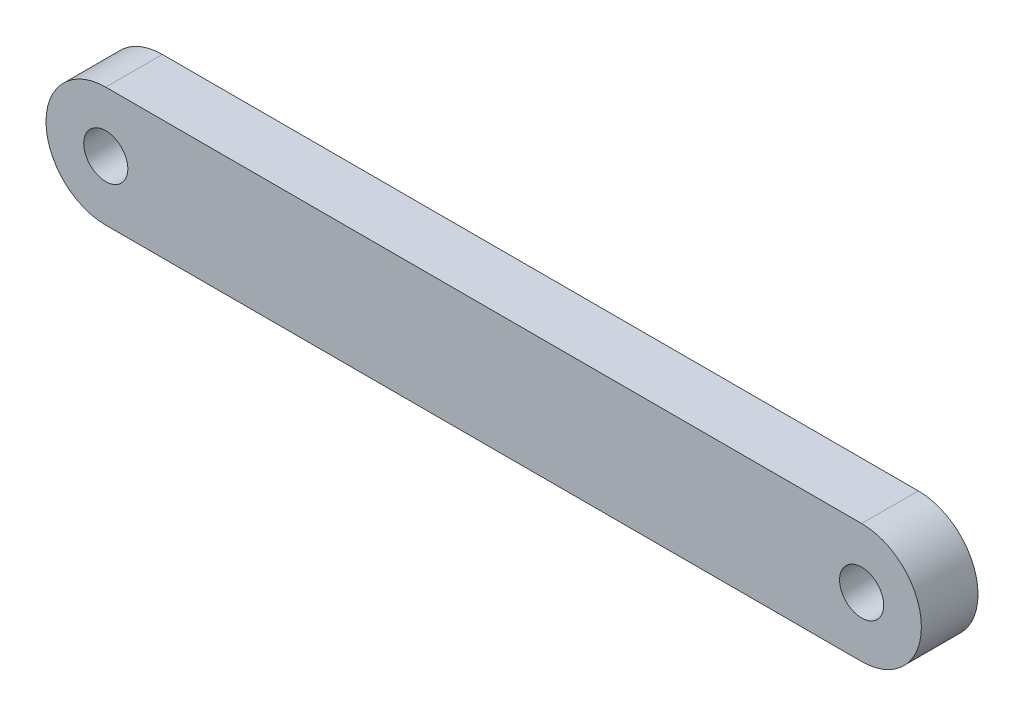
ISO-10303-21;
HEADER;
FILE_DESCRIPTION(('STEP AP214'),'2;1');
FILE_NAME('part.step','',(''),(''),'','','');
FILE_SCHEMA(('AUTOMOTIVE_DESIGN { 1 0 10303 214 1 1 1 1 }'));
ENDSEC;
DATA;
#1=APPLICATION_CONTEXT('core data for automotive mechanical design processes');
#2=APPLICATION_PROTOCOL_DEFINITION('international standard','automotive_design',2000,#1);
#3=PRODUCT_CONTEXT('',#1,'mechanical');
#4=PRODUCT('Part','Part','',(#3));
#5=PRODUCT_RELATED_PRODUCT_CATEGORY('part','',(#4));
#6=PRODUCT_DEFINITION_FORMATION('','',#4);
#7=PRODUCT_DEFINITION_CONTEXT('part definition',#1,'design');
#8=PRODUCT_DEFINITION('design','',#6,#7);
#9=PRODUCT_DEFINITION_SHAPE('','',#8);
#10=(LENGTH_UNIT() NAMED_UNIT(*) SI_UNIT(.MILLI.,.METRE.));
#11=(NAMED_UNIT(*) PLANE_ANGLE_UNIT() SI_UNIT($,.RADIAN.));
#12=(NAMED_UNIT(*) SI_UNIT($,.STERADIAN.) SOLID_ANGLE_UNIT());
#13=UNCERTAINTY_MEASURE_WITH_UNIT(LENGTH_MEASURE(1.E-05),#10,'distance_accuracy_value','');
#14=(GEOMETRIC_REPRESENTATION_CONTEXT(3) GLOBAL_UNCERTAINTY_ASSIGNED_CONTEXT((#13)) GLOBAL_UNIT_ASSIGNED_CONTEXT((#10,
#11,#12)) REPRESENTATION_CONTEXT('',''));
#15=CARTESIAN_POINT('',(0.,0.,0.));
#16=DIRECTION('',(0.,0.,1.));
#17=DIRECTION('',(1.,0.,0.));
#18=AXIS2_PLACEMENT_3D('',#15,#16,#17);
#19=CARTESIAN_POINT('',(30.0111037038316,49.9284496871534,-4.4958));
#20=DIRECTION('',(0.,0.,-1.));
#21=DIRECTION('',(-1.,0.,0.));
#22=AXIS2_PLACEMENT_3D('',#19,#20,#21);
#23=PLANE('',#22);
#24=CARTESIAN_POINT('',(30.0111037038316,49.9284496871534,-4.4958));
#25=DIRECTION('',(0.,0.,-1.));
#26=DIRECTION('',(-1.,0.,0.));
#27=AXIS2_PLACEMENT_3D('',#24,#25,#26);
#28=CIRCLE('',#27,1.75);
#29=CARTESIAN_POINT('',(28.2611037038316,49.9284496871534,-4.4958));
#30=VERTEX_POINT('',#29);
#31=EDGE_CURVE('E100',#30,#30,#28,.T.);
#32=ORIENTED_EDGE('',*,*,#31,.F.);
#33=EDGE_LOOP('',(#32));
#34=FACE_BOUND('',#33,.T.);
#35=CARTESIAN_POINT('',(30.0111037038316,49.9284496871534,-4.4958));
#36=DIRECTION('',(0.,0.,-1.));
#37=DIRECTION('',(-1.,0.,0.));
#38=AXIS2_PLACEMENT_3D('',#35,#36,#37);
#39=CIRCLE('',#38,4.74610370383154);
#40=CARTESIAN_POINT('',(30.0111037038316,54.674553390985,-4.4958));
#41=VERTEX_POINT('',#40);
#42=CARTESIAN_POINT('',(30.0111037038316,45.1823459833219,-4.4958));
#43=VERTEX_POINT('',#42);
#44=EDGE_CURVE('E85',#41,#43,#39,.T.);
#45=ORIENTED_EDGE('',*,*,#44,.T.);
#46=DIRECTION('',(-1.,0.,0.));
#47=VECTOR('',#46,1.);
#48=CARTESIAN_POINT('',(30.0111037038316,45.1823459833219,-4.4958));
#49=LINE('',#48,#47);
#50=CARTESIAN_POINT('',(-30.0111037038316,45.1823459833219,-4.4958));
#51=VERTEX_POINT('',#50);
#52=EDGE_CURVE('E80',#43,#51,#49,.T.);
#53=ORIENTED_EDGE('',*,*,#52,.T.);
#54=CARTESIAN_POINT('',(-30.0111037038316,49.9284496871534,-4.4958));
#55=DIRECTION('',(0.,0.,-1.));
#56=DIRECTION('',(-1.,0.,0.));
#57=AXIS2_PLACEMENT_3D('',#54,#55,#56);
#58=CIRCLE('',#57,4.74610370383154);
#59=CARTESIAN_POINT('',(-30.0111037038316,54.674553390985,-4.4958));
#60=VERTEX_POINT('',#59);
#61=EDGE_CURVE('E83',#51,#60,#58,.T.);
#62=ORIENTED_EDGE('',*,*,#61,.T.);
#63=DIRECTION('',(1.,0.,0.));
#64=VECTOR('',#63,1.);
#65=CARTESIAN_POINT('',(30.0111037038316,54.674553390985,-4.4958));
#66=LINE('',#65,#64);
#67=EDGE_CURVE('E50',#60,#41,#66,.T.);
#68=ORIENTED_EDGE('',*,*,#67,.T.);
#69=EDGE_LOOP('',(#45,#53,#62,#68));
#70=FACE_BOUND('',#69,.T.);
#71=CARTESIAN_POINT('',(-30.0111037038316,49.9284496871534,-4.4958));
#72=DIRECTION('',(0.,0.,-1.));
#73=DIRECTION('',(-1.,0.,0.));
#74=AXIS2_PLACEMENT_3D('',#71,#72,#73);
#75=CIRCLE('',#74,1.75);
#76=CARTESIAN_POINT('',(-31.7611037038316,49.9284496871534,-4.4958));
#77=VERTEX_POINT('',#76);
#78=EDGE_CURVE('E115',#77,#77,#75,.T.);
#79=ORIENTED_EDGE('',*,*,#78,.F.);
#80=EDGE_LOOP('',(#79));
#81=FACE_BOUND('',#80,.T.);
#82=ADVANCED_FACE('F33',(#34,#70,#81),#23,.T.);
#83=CARTESIAN_POINT('',(30.0111037038316,49.9284496871534,0.));
#84=DIRECTION('',(0.,0.,-1.));
#85=DIRECTION('',(-1.,0.,0.));
#86=AXIS2_PLACEMENT_3D('',#83,#84,#85);
#87=PLANE('',#86);
#88=CARTESIAN_POINT('',(30.0111037038316,49.9284496871534,0.));
#89=DIRECTION('',(0.,0.,-1.));
#90=DIRECTION('',(-1.,0.,0.));
#91=AXIS2_PLACEMENT_3D('',#88,#89,#90);
#92=CIRCLE('',#91,4.74610370383154);
#93=CARTESIAN_POINT('',(30.0111037038316,54.674553390985,0.));
#94=VERTEX_POINT('',#93);
#95=CARTESIAN_POINT('',(30.0111037038316,45.1823459833219,0.));
#96=VERTEX_POINT('',#95);
#97=EDGE_CURVE('E97',#94,#96,#92,.T.);
#98=ORIENTED_EDGE('',*,*,#97,.F.);
#99=DIRECTION('',(1.,0.,0.));
#100=VECTOR('',#99,1.);
#101=CARTESIAN_POINT('',(30.0111037038316,54.674553390985,0.));
#102=LINE('',#101,#100);
#103=CARTESIAN_POINT('',(-30.0111037038316,54.674553390985,0.));
#104=VERTEX_POINT('',#103);
#105=EDGE_CURVE('E73',#104,#94,#102,.T.);
#106=ORIENTED_EDGE('',*,*,#105,.F.);
#107=CARTESIAN_POINT('',(-30.0111037038316,49.9284496871534,0.));
#108=DIRECTION('',(0.,0.,-1.));
#109=DIRECTION('',(-1.,0.,0.));
#110=AXIS2_PLACEMENT_3D('',#107,#108,#109);
#111=CIRCLE('',#110,4.74610370383154);
#112=CARTESIAN_POINT('',(-30.0111037038316,45.1823459833219,0.));
#113=VERTEX_POINT('',#112);
#114=EDGE_CURVE('E67',#113,#104,#111,.T.);
#115=ORIENTED_EDGE('',*,*,#114,.F.);
#116=DIRECTION('',(-1.,0.,0.));
#117=VECTOR('',#116,1.);
#118=CARTESIAN_POINT('',(30.0111037038316,45.1823459833219,0.));
#119=LINE('',#118,#117);
#120=EDGE_CURVE('E89',#96,#113,#119,.T.);
#121=ORIENTED_EDGE('',*,*,#120,.F.);
#122=EDGE_LOOP('',(#98,#106,#115,#121));
#123=FACE_BOUND('',#122,.T.);
#124=CARTESIAN_POINT('',(30.0111037038316,49.9284496871534,0.));
#125=DIRECTION('',(0.,0.,-1.));
#126=DIRECTION('',(-1.,0.,0.));
#127=AXIS2_PLACEMENT_3D('',#124,#125,#126);
#128=CIRCLE('',#127,1.75);
#129=CARTESIAN_POINT('',(28.2611037038316,49.9284496871534,0.));
#130=VERTEX_POINT('',#129);
#131=EDGE_CURVE('E112',#130,#130,#128,.T.);
#132=ORIENTED_EDGE('',*,*,#131,.T.);
#133=EDGE_LOOP('',(#132));
#134=FACE_BOUND('',#133,.T.);
#135=CARTESIAN_POINT('',(-30.0111037038316,49.9284496871534,0.));
#136=DIRECTION('',(0.,0.,-1.));
#137=DIRECTION('',(-1.,0.,0.));
#138=AXIS2_PLACEMENT_3D('',#135,#136,#137);
#139=CIRCLE('',#138,1.75);
#140=CARTESIAN_POINT('',(-31.7611037038316,49.9284496871534,0.));
#141=VERTEX_POINT('',#140);
#142=EDGE_CURVE('E118',#141,#141,#139,.T.);
#143=ORIENTED_EDGE('',*,*,#142,.T.);
#144=EDGE_LOOP('',(#143));
#145=FACE_BOUND('',#144,.T.);
#146=ADVANCED_FACE('F108',(#123,#134,#145),#87,.F.);
#147=CARTESIAN_POINT('',(30.0111037038316,49.9284496871534,-4.4958));
#148=DIRECTION('',(0.,0.,1.));
#149=DIRECTION('',(1.,0.,0.));
#150=AXIS2_PLACEMENT_3D('',#147,#148,#149);
#151=CYLINDRICAL_SURFACE('',#150,4.74610370383154);
#152=ORIENTED_EDGE('',*,*,#97,.T.);
#153=DIRECTION('',(0.,0.,1.));
#154=VECTOR('',#153,1.);
#155=CARTESIAN_POINT('',(30.0111037038316,45.1823459833219,-4.4958));
#156=LINE('',#155,#154);
#157=EDGE_CURVE('E11',#43,#96,#156,.T.);
#158=ORIENTED_EDGE('',*,*,#157,.F.);
#159=ORIENTED_EDGE('',*,*,#44,.F.);
#160=DIRECTION('',(0.,0.,1.));
#161=VECTOR('',#160,1.);
#162=CARTESIAN_POINT('',(30.0111037038316,54.674553390985,-4.4958));
#163=LINE('',#162,#161);
#164=EDGE_CURVE('E93',#41,#94,#163,.T.);
#165=ORIENTED_EDGE('',*,*,#164,.T.);
#166=EDGE_LOOP('',(#152,#158,#159,#165));
#167=FACE_BOUND('',#166,.T.);
#168=ADVANCED_FACE('F35',(#167),#151,.T.);
#169=CARTESIAN_POINT('',(30.0111037038316,45.1823459833219,-4.4958));
#170=DIRECTION('',(0.,1.,0.));
#171=DIRECTION('',(0.,0.,1.));
#172=AXIS2_PLACEMENT_3D('',#169,#170,#171);
#173=PLANE('',#172);
#174=ORIENTED_EDGE('',*,*,#120,.T.);
#175=DIRECTION('',(0.,0.,1.));
#176=VECTOR('',#175,1.);
#177=CARTESIAN_POINT('',(-30.0111037038316,45.1823459833219,-4.4958));
#178=LINE('',#177,#176);
#179=EDGE_CURVE('E42',#51,#113,#178,.T.);
#180=ORIENTED_EDGE('',*,*,#179,.F.);
#181=ORIENTED_EDGE('',*,*,#52,.F.);
#182=ORIENTED_EDGE('',*,*,#157,.T.);
#183=EDGE_LOOP('',(#174,#180,#181,#182));
#184=FACE_BOUND('',#183,.T.);
#185=ADVANCED_FACE('F88',(#184),#173,.F.);
#186=CARTESIAN_POINT('',(-30.0111037038316,49.9284496871534,-4.4958));
#187=DIRECTION('',(0.,0.,1.));
#188=DIRECTION('',(1.,0.,0.));
#189=AXIS2_PLACEMENT_3D('',#186,#187,#188);
#190=CYLINDRICAL_SURFACE('',#189,4.74610370383154);
#191=ORIENTED_EDGE('',*,*,#114,.T.);
#192=DIRECTION('',(0.,0.,1.));
#193=VECTOR('',#192,1.);
#194=CARTESIAN_POINT('',(-30.0111037038316,54.674553390985,-4.4958));
#195=LINE('',#194,#193);
#196=EDGE_CURVE('E90',#60,#104,#195,.T.);
#197=ORIENTED_EDGE('',*,*,#196,.F.);
#198=ORIENTED_EDGE('',*,*,#61,.F.);
#199=ORIENTED_EDGE('',*,*,#179,.T.);
#200=EDGE_LOOP('',(#191,#197,#198,#199));
#201=FACE_BOUND('',#200,.T.);
#202=ADVANCED_FACE('F91',(#201),#190,.T.);
#203=CARTESIAN_POINT('',(30.0111037038316,54.674553390985,-4.4958));
#204=DIRECTION('',(0.,-1.,0.));
#205=DIRECTION('',(0.,0.,-1.));
#206=AXIS2_PLACEMENT_3D('',#203,#204,#205);
#207=PLANE('',#206);
#208=ORIENTED_EDGE('',*,*,#105,.T.);
#209=ORIENTED_EDGE('',*,*,#164,.F.);
#210=ORIENTED_EDGE('',*,*,#67,.F.);
#211=ORIENTED_EDGE('',*,*,#196,.T.);
#212=EDGE_LOOP('',(#208,#209,#210,#211));
#213=FACE_BOUND('',#212,.T.);
#214=ADVANCED_FACE('F105',(#213),#207,.F.);
#215=CARTESIAN_POINT('',(30.0111037038316,49.9284496871534,-4.4958));
#216=DIRECTION('',(0.,0.,1.));
#217=DIRECTION('',(1.,0.,0.));
#218=AXIS2_PLACEMENT_3D('',#215,#216,#217);
#219=CYLINDRICAL_SURFACE('',#218,1.75);
#220=ORIENTED_EDGE('',*,*,#31,.T.);
#221=EDGE_LOOP('',(#220));
#222=FACE_BOUND('',#221,.T.);
#223=ORIENTED_EDGE('',*,*,#131,.F.);
#224=EDGE_LOOP('',(#223));
#225=FACE_BOUND('',#224,.T.);
#226=ADVANCED_FACE('F135',(#222,#225),#219,.F.);
#227=CARTESIAN_POINT('',(-30.0111037038316,49.9284496871534,-4.4958));
#228=DIRECTION('',(0.,0.,1.));
#229=DIRECTION('',(1.,0.,0.));
#230=AXIS2_PLACEMENT_3D('',#227,#228,#229);
#231=CYLINDRICAL_SURFACE('',#230,1.75);
#232=ORIENTED_EDGE('',*,*,#78,.T.);
#233=EDGE_LOOP('',(#232));
#234=FACE_BOUND('',#233,.T.);
#235=ORIENTED_EDGE('',*,*,#142,.F.);
#236=EDGE_LOOP('',(#235));
#237=FACE_BOUND('',#236,.T.);
#238=ADVANCED_FACE('F124',(#234,#237),#231,.F.);
#239=CLOSED_SHELL('',(#82,#146,#168,#185,#202,#214,#226,#238));
#240=MANIFOLD_SOLID_BREP('B2',#239);
#241=ADVANCED_BREP_SHAPE_REPRESENTATION('',(#18,#240),#14);
#242=SHAPE_DEFINITION_REPRESENTATION(#9,#241);
ENDSEC;
END-ISO-10303-21;
